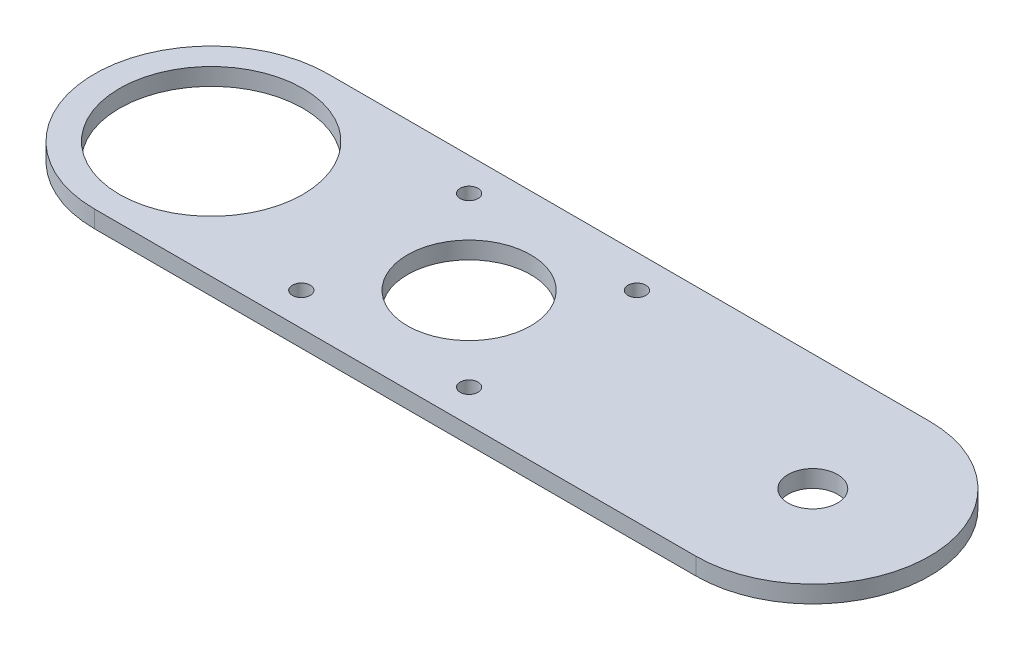
ISO-10303-21;
HEADER;
FILE_DESCRIPTION(('STEP AP214'),'2;1');
FILE_NAME('part.step','',(''),(''),'','','');
FILE_SCHEMA(('AUTOMOTIVE_DESIGN { 1 0 10303 214 1 1 1 1 }'));
ENDSEC;
DATA;
#1=APPLICATION_CONTEXT('core data for automotive mechanical design processes');
#2=APPLICATION_PROTOCOL_DEFINITION('international standard','automotive_design',2000,#1);
#3=PRODUCT_CONTEXT('',#1,'mechanical');
#4=PRODUCT('Part','Part','',(#3));
#5=PRODUCT_RELATED_PRODUCT_CATEGORY('part','',(#4));
#6=PRODUCT_DEFINITION_FORMATION('','',#4);
#7=PRODUCT_DEFINITION_CONTEXT('part definition',#1,'design');
#8=PRODUCT_DEFINITION('design','',#6,#7);
#9=PRODUCT_DEFINITION_SHAPE('','',#8);
#10=(LENGTH_UNIT() NAMED_UNIT(*) SI_UNIT(.MILLI.,.METRE.));
#11=(NAMED_UNIT(*) PLANE_ANGLE_UNIT() SI_UNIT($,.RADIAN.));
#12=(NAMED_UNIT(*) SI_UNIT($,.STERADIAN.) SOLID_ANGLE_UNIT());
#13=UNCERTAINTY_MEASURE_WITH_UNIT(LENGTH_MEASURE(1.E-05),#10,'distance_accuracy_value','');
#14=(GEOMETRIC_REPRESENTATION_CONTEXT(3) GLOBAL_UNCERTAINTY_ASSIGNED_CONTEXT((#13)) GLOBAL_UNIT_ASSIGNED_CONTEXT((#10,
#11,#12)) REPRESENTATION_CONTEXT('',''));
#15=CARTESIAN_POINT('',(0.,0.,0.));
#16=DIRECTION('',(0.,0.,1.));
#17=DIRECTION('',(1.,0.,0.));
#18=AXIS2_PLACEMENT_3D('',#15,#16,#17);
#19=CARTESIAN_POINT('',(0.,3.175,0.));
#20=DIRECTION('',(0.,1.,0.));
#21=DIRECTION('',(0.,0.,1.));
#22=AXIS2_PLACEMENT_3D('',#19,#20,#21);
#23=PLANE('',#22);
#24=CARTESIAN_POINT('',(63.1504,3.175,-15.5));
#25=DIRECTION('',(0.,1.,0.));
#26=DIRECTION('',(0.,0.,-1.));
#27=AXIS2_PLACEMENT_3D('',#24,#25,#26);
#28=CIRCLE('',#27,1.65099999999999);
#29=CARTESIAN_POINT('',(63.1504,3.175,-17.151));
#30=VERTEX_POINT('',#29);
#31=EDGE_CURVE('E139',#30,#30,#28,.T.);
#32=ORIENTED_EDGE('',*,*,#31,.F.);
#33=EDGE_LOOP('',(#32));
#34=FACE_BOUND('',#33,.T.);
#35=CARTESIAN_POINT('',(32.1504,3.175,15.5));
#36=DIRECTION('',(0.,1.,0.));
#37=DIRECTION('',(0.,0.,1.));
#38=AXIS2_PLACEMENT_3D('',#35,#36,#37);
#39=CIRCLE('',#38,1.651);
#40=CARTESIAN_POINT('',(32.1504,3.175,17.151));
#41=VERTEX_POINT('',#40);
#42=EDGE_CURVE('E127',#41,#41,#39,.T.);
#43=ORIENTED_EDGE('',*,*,#42,.F.);
#44=EDGE_LOOP('',(#43));
#45=FACE_BOUND('',#44,.T.);
#46=CARTESIAN_POINT('',(111.1504,3.175,0.));
#47=DIRECTION('',(0.,1.,0.));
#48=DIRECTION('',(0.,0.,1.));
#49=AXIS2_PLACEMENT_3D('',#46,#47,#48);
#50=CIRCLE('',#49,4.57199999999999);
#51=CARTESIAN_POINT('',(111.1504,3.175,4.57199999999998));
#52=VERTEX_POINT('',#51);
#53=EDGE_CURVE('E115',#52,#52,#50,.T.);
#54=ORIENTED_EDGE('',*,*,#53,.F.);
#55=EDGE_LOOP('',(#54));
#56=FACE_BOUND('',#55,.T.);
#57=CARTESIAN_POINT('',(0.,3.175,0.));
#58=DIRECTION('',(0.,1.,0.));
#59=DIRECTION('',(0.,0.,1.));
#60=AXIS2_PLACEMENT_3D('',#57,#58,#59);
#61=CIRCLE('',#60,21.59);
#62=CARTESIAN_POINT('',(0.,3.175,-21.59));
#63=VERTEX_POINT('',#62);
#64=CARTESIAN_POINT('',(0.,3.175,21.59));
#65=VERTEX_POINT('',#64);
#66=EDGE_CURVE('E85',#63,#65,#61,.T.);
#67=ORIENTED_EDGE('',*,*,#66,.T.);
#68=DIRECTION('',(1.,0.,0.));
#69=VECTOR('',#68,1.);
#70=CARTESIAN_POINT('',(0.,3.175,21.59));
#71=LINE('',#70,#69);
#72=CARTESIAN_POINT('',(111.1504,3.175,21.59));
#73=VERTEX_POINT('',#72);
#74=EDGE_CURVE('E80',#65,#73,#71,.T.);
#75=ORIENTED_EDGE('',*,*,#74,.T.);
#76=CARTESIAN_POINT('',(111.1504,3.175,0.));
#77=DIRECTION('',(0.,1.,0.));
#78=DIRECTION('',(0.,0.,1.));
#79=AXIS2_PLACEMENT_3D('',#76,#77,#78);
#80=CIRCLE('',#79,21.59);
#81=CARTESIAN_POINT('',(111.1504,3.175,-21.59));
#82=VERTEX_POINT('',#81);
#83=EDGE_CURVE('E83',#73,#82,#80,.T.);
#84=ORIENTED_EDGE('',*,*,#83,.T.);
#85=DIRECTION('',(-1.,0.,0.));
#86=VECTOR('',#85,1.);
#87=CARTESIAN_POINT('',(0.,3.175,-21.59));
#88=LINE('',#87,#86);
#89=EDGE_CURVE('E50',#82,#63,#88,.T.);
#90=ORIENTED_EDGE('',*,*,#89,.T.);
#91=EDGE_LOOP('',(#67,#75,#84,#90));
#92=FACE_BOUND('',#91,.T.);
#93=CARTESIAN_POINT('',(0.,3.175,0.));
#94=DIRECTION('',(0.,1.,0.));
#95=DIRECTION('',(0.,0.,1.));
#96=AXIS2_PLACEMENT_3D('',#93,#94,#95);
#97=CIRCLE('',#96,16.9545);
#98=CARTESIAN_POINT('',(0.,3.175,16.9545));
#99=VERTEX_POINT('',#98);
#100=EDGE_CURVE('E100',#99,#99,#97,.T.);
#101=ORIENTED_EDGE('',*,*,#100,.F.);
#102=EDGE_LOOP('',(#101));
#103=FACE_BOUND('',#102,.T.);
#104=CARTESIAN_POINT('',(47.6504,3.175,0.));
#105=DIRECTION('',(0.,1.,0.));
#106=DIRECTION('',(0.,0.,1.));
#107=AXIS2_PLACEMENT_3D('',#104,#105,#106);
#108=CIRCLE('',#107,11.380999971);
#109=CARTESIAN_POINT('',(47.6504,3.175,11.380999971));
#110=VERTEX_POINT('',#109);
#111=EDGE_CURVE('E121',#110,#110,#108,.T.);
#112=ORIENTED_EDGE('',*,*,#111,.F.);
#113=EDGE_LOOP('',(#112));
#114=FACE_BOUND('',#113,.T.);
#115=CARTESIAN_POINT('',(32.1504,3.175,-15.5));
#116=DIRECTION('',(0.,1.,0.));
#117=DIRECTION('',(0.,0.,1.));
#118=AXIS2_PLACEMENT_3D('',#115,#116,#117);
#119=CIRCLE('',#118,1.651);
#120=CARTESIAN_POINT('',(32.1504,3.175,-13.849));
#121=VERTEX_POINT('',#120);
#122=EDGE_CURVE('E133',#121,#121,#119,.T.);
#123=ORIENTED_EDGE('',*,*,#122,.F.);
#124=EDGE_LOOP('',(#123));
#125=FACE_BOUND('',#124,.T.);
#126=CARTESIAN_POINT('',(63.1504,3.175,15.5));
#127=DIRECTION('',(0.,1.,0.));
#128=DIRECTION('',(0.,0.,-1.));
#129=AXIS2_PLACEMENT_3D('',#126,#127,#128);
#130=CIRCLE('',#129,1.65099999999999);
#131=CARTESIAN_POINT('',(63.1504,3.175,13.849));
#132=VERTEX_POINT('',#131);
#133=EDGE_CURVE('E145',#132,#132,#130,.T.);
#134=ORIENTED_EDGE('',*,*,#133,.F.);
#135=EDGE_LOOP('',(#134));
#136=FACE_BOUND('',#135,.T.);
#137=ADVANCED_FACE('F33',(#34,#45,#56,#92,#103,#114,#125,#136),#23,.T.);
#138=CARTESIAN_POINT('',(0.,0.,0.));
#139=DIRECTION('',(0.,1.,0.));
#140=DIRECTION('',(0.,0.,1.));
#141=AXIS2_PLACEMENT_3D('',#138,#139,#140);
#142=PLANE('',#141);
#143=CARTESIAN_POINT('',(0.,0.,0.));
#144=DIRECTION('',(0.,1.,0.));
#145=DIRECTION('',(0.,0.,1.));
#146=AXIS2_PLACEMENT_3D('',#143,#144,#145);
#147=CIRCLE('',#146,21.59);
#148=CARTESIAN_POINT('',(0.,0.,-21.59));
#149=VERTEX_POINT('',#148);
#150=CARTESIAN_POINT('',(0.,0.,21.59));
#151=VERTEX_POINT('',#150);
#152=EDGE_CURVE('E97',#149,#151,#147,.T.);
#153=ORIENTED_EDGE('',*,*,#152,.F.);
#154=DIRECTION('',(-1.,0.,0.));
#155=VECTOR('',#154,1.);
#156=CARTESIAN_POINT('',(0.,0.,-21.59));
#157=LINE('',#156,#155);
#158=CARTESIAN_POINT('',(111.1504,0.,-21.59));
#159=VERTEX_POINT('',#158);
#160=EDGE_CURVE('E73',#159,#149,#157,.T.);
#161=ORIENTED_EDGE('',*,*,#160,.F.);
#162=CARTESIAN_POINT('',(111.1504,0.,0.));
#163=DIRECTION('',(0.,1.,0.));
#164=DIRECTION('',(0.,0.,1.));
#165=AXIS2_PLACEMENT_3D('',#162,#163,#164);
#166=CIRCLE('',#165,21.59);
#167=CARTESIAN_POINT('',(111.1504,0.,21.59));
#168=VERTEX_POINT('',#167);
#169=EDGE_CURVE('E67',#168,#159,#166,.T.);
#170=ORIENTED_EDGE('',*,*,#169,.F.);
#171=DIRECTION('',(1.,0.,0.));
#172=VECTOR('',#171,1.);
#173=CARTESIAN_POINT('',(0.,0.,21.59));
#174=LINE('',#173,#172);
#175=EDGE_CURVE('E89',#151,#168,#174,.T.);
#176=ORIENTED_EDGE('',*,*,#175,.F.);
#177=EDGE_LOOP('',(#153,#161,#170,#176));
#178=FACE_BOUND('',#177,.T.);
#179=CARTESIAN_POINT('',(0.,0.,0.));
#180=DIRECTION('',(0.,1.,0.));
#181=DIRECTION('',(0.,0.,1.));
#182=AXIS2_PLACEMENT_3D('',#179,#180,#181);
#183=CIRCLE('',#182,16.9545);
#184=CARTESIAN_POINT('',(0.,0.,16.9545));
#185=VERTEX_POINT('',#184);
#186=EDGE_CURVE('E112',#185,#185,#183,.T.);
#187=ORIENTED_EDGE('',*,*,#186,.T.);
#188=EDGE_LOOP('',(#187));
#189=FACE_BOUND('',#188,.T.);
#190=CARTESIAN_POINT('',(111.1504,0.,0.));
#191=DIRECTION('',(0.,1.,0.));
#192=DIRECTION('',(0.,0.,1.));
#193=AXIS2_PLACEMENT_3D('',#190,#191,#192);
#194=CIRCLE('',#193,4.57199999999999);
#195=CARTESIAN_POINT('',(111.1504,0.,4.57199999999998));
#196=VERTEX_POINT('',#195);
#197=EDGE_CURVE('E118',#196,#196,#194,.T.);
#198=ORIENTED_EDGE('',*,*,#197,.T.);
#199=EDGE_LOOP('',(#198));
#200=FACE_BOUND('',#199,.T.);
#201=CARTESIAN_POINT('',(47.6504,0.,0.));
#202=DIRECTION('',(0.,1.,0.));
#203=DIRECTION('',(0.,0.,1.));
#204=AXIS2_PLACEMENT_3D('',#201,#202,#203);
#205=CIRCLE('',#204,11.380999971);
#206=CARTESIAN_POINT('',(47.6504,0.,11.380999971));
#207=VERTEX_POINT('',#206);
#208=EDGE_CURVE('E124',#207,#207,#205,.T.);
#209=ORIENTED_EDGE('',*,*,#208,.T.);
#210=EDGE_LOOP('',(#209));
#211=FACE_BOUND('',#210,.T.);
#212=CARTESIAN_POINT('',(32.1504,0.,15.5));
#213=DIRECTION('',(0.,1.,0.));
#214=DIRECTION('',(0.,0.,1.));
#215=AXIS2_PLACEMENT_3D('',#212,#213,#214);
#216=CIRCLE('',#215,1.651);
#217=CARTESIAN_POINT('',(32.1504,0.,17.151));
#218=VERTEX_POINT('',#217);
#219=EDGE_CURVE('E130',#218,#218,#216,.T.);
#220=ORIENTED_EDGE('',*,*,#219,.T.);
#221=EDGE_LOOP('',(#220));
#222=FACE_BOUND('',#221,.T.);
#223=CARTESIAN_POINT('',(32.1504,0.,-15.5));
#224=DIRECTION('',(0.,1.,0.));
#225=DIRECTION('',(0.,0.,1.));
#226=AXIS2_PLACEMENT_3D('',#223,#224,#225);
#227=CIRCLE('',#226,1.651);
#228=CARTESIAN_POINT('',(32.1504,0.,-13.849));
#229=VERTEX_POINT('',#228);
#230=EDGE_CURVE('E136',#229,#229,#227,.T.);
#231=ORIENTED_EDGE('',*,*,#230,.T.);
#232=EDGE_LOOP('',(#231));
#233=FACE_BOUND('',#232,.T.);
#234=CARTESIAN_POINT('',(63.1504,0.,-15.5));
#235=DIRECTION('',(0.,1.,0.));
#236=DIRECTION('',(0.,0.,-1.));
#237=AXIS2_PLACEMENT_3D('',#234,#235,#236);
#238=CIRCLE('',#237,1.65099999999999);
#239=CARTESIAN_POINT('',(63.1504,0.,-17.151));
#240=VERTEX_POINT('',#239);
#241=EDGE_CURVE('E142',#240,#240,#238,.T.);
#242=ORIENTED_EDGE('',*,*,#241,.T.);
#243=EDGE_LOOP('',(#242));
#244=FACE_BOUND('',#243,.T.);
#245=CARTESIAN_POINT('',(63.1504,0.,15.5));
#246=DIRECTION('',(0.,1.,0.));
#247=DIRECTION('',(0.,0.,-1.));
#248=AXIS2_PLACEMENT_3D('',#245,#246,#247);
#249=CIRCLE('',#248,1.65099999999999);
#250=CARTESIAN_POINT('',(63.1504,0.,13.849));
#251=VERTEX_POINT('',#250);
#252=EDGE_CURVE('E148',#251,#251,#249,.T.);
#253=ORIENTED_EDGE('',*,*,#252,.T.);
#254=EDGE_LOOP('',(#253));
#255=FACE_BOUND('',#254,.T.);
#256=ADVANCED_FACE('F108',(#178,#189,#200,#211,#222,#233,#244,#255),#142,.F.);
#257=CARTESIAN_POINT('',(0.,3.175,0.));
#258=DIRECTION('',(0.,-1.,0.));
#259=DIRECTION('',(0.,0.,-1.));
#260=AXIS2_PLACEMENT_3D('',#257,#258,#259);
#261=CYLINDRICAL_SURFACE('',#260,21.59);
#262=ORIENTED_EDGE('',*,*,#152,.T.);
#263=DIRECTION('',(0.,-1.,0.));
#264=VECTOR('',#263,1.);
#265=CARTESIAN_POINT('',(0.,3.175,21.59));
#266=LINE('',#265,#264);
#267=EDGE_CURVE('E11',#65,#151,#266,.T.);
#268=ORIENTED_EDGE('',*,*,#267,.F.);
#269=ORIENTED_EDGE('',*,*,#66,.F.);
#270=DIRECTION('',(0.,-1.,0.));
#271=VECTOR('',#270,1.);
#272=CARTESIAN_POINT('',(0.,3.175,-21.59));
#273=LINE('',#272,#271);
#274=EDGE_CURVE('E93',#63,#149,#273,.T.);
#275=ORIENTED_EDGE('',*,*,#274,.T.);
#276=EDGE_LOOP('',(#262,#268,#269,#275));
#277=FACE_BOUND('',#276,.T.);
#278=ADVANCED_FACE('F35',(#277),#261,.T.);
#279=CARTESIAN_POINT('',(0.,3.175,21.59));
#280=DIRECTION('',(0.,0.,-1.));
#281=DIRECTION('',(-1.,0.,0.));
#282=AXIS2_PLACEMENT_3D('',#279,#280,#281);
#283=PLANE('',#282);
#284=ORIENTED_EDGE('',*,*,#175,.T.);
#285=DIRECTION('',(0.,-1.,0.));
#286=VECTOR('',#285,1.);
#287=CARTESIAN_POINT('',(111.1504,3.175,21.59));
#288=LINE('',#287,#286);
#289=EDGE_CURVE('E42',#73,#168,#288,.T.);
#290=ORIENTED_EDGE('',*,*,#289,.F.);
#291=ORIENTED_EDGE('',*,*,#74,.F.);
#292=ORIENTED_EDGE('',*,*,#267,.T.);
#293=EDGE_LOOP('',(#284,#290,#291,#292));
#294=FACE_BOUND('',#293,.T.);
#295=ADVANCED_FACE('F88',(#294),#283,.F.);
#296=CARTESIAN_POINT('',(111.1504,3.175,0.));
#297=DIRECTION('',(0.,-1.,0.));
#298=DIRECTION('',(0.,0.,-1.));
#299=AXIS2_PLACEMENT_3D('',#296,#297,#298);
#300=CYLINDRICAL_SURFACE('',#299,21.59);
#301=ORIENTED_EDGE('',*,*,#169,.T.);
#302=DIRECTION('',(0.,-1.,0.));
#303=VECTOR('',#302,1.);
#304=CARTESIAN_POINT('',(111.1504,3.175,-21.59));
#305=LINE('',#304,#303);
#306=EDGE_CURVE('E90',#82,#159,#305,.T.);
#307=ORIENTED_EDGE('',*,*,#306,.F.);
#308=ORIENTED_EDGE('',*,*,#83,.F.);
#309=ORIENTED_EDGE('',*,*,#289,.T.);
#310=EDGE_LOOP('',(#301,#307,#308,#309));
#311=FACE_BOUND('',#310,.T.);
#312=ADVANCED_FACE('F91',(#311),#300,.T.);
#313=CARTESIAN_POINT('',(0.,3.175,-21.59));
#314=DIRECTION('',(0.,0.,1.));
#315=DIRECTION('',(1.,0.,0.));
#316=AXIS2_PLACEMENT_3D('',#313,#314,#315);
#317=PLANE('',#316);
#318=ORIENTED_EDGE('',*,*,#160,.T.);
#319=ORIENTED_EDGE('',*,*,#274,.F.);
#320=ORIENTED_EDGE('',*,*,#89,.F.);
#321=ORIENTED_EDGE('',*,*,#306,.T.);
#322=EDGE_LOOP('',(#318,#319,#320,#321));
#323=FACE_BOUND('',#322,.T.);
#324=ADVANCED_FACE('F105',(#323),#317,.F.);
#325=CARTESIAN_POINT('',(0.,3.175,0.));
#326=DIRECTION('',(0.,-1.,0.));
#327=DIRECTION('',(0.,0.,-1.));
#328=AXIS2_PLACEMENT_3D('',#325,#326,#327);
#329=CYLINDRICAL_SURFACE('',#328,16.9545);
#330=ORIENTED_EDGE('',*,*,#100,.T.);
#331=EDGE_LOOP('',(#330));
#332=FACE_BOUND('',#331,.T.);
#333=ORIENTED_EDGE('',*,*,#186,.F.);
#334=EDGE_LOOP('',(#333));
#335=FACE_BOUND('',#334,.T.);
#336=ADVANCED_FACE('F167',(#332,#335),#329,.F.);
#337=CARTESIAN_POINT('',(111.1504,3.175,0.));
#338=DIRECTION('',(0.,-1.,0.));
#339=DIRECTION('',(0.,0.,-1.));
#340=AXIS2_PLACEMENT_3D('',#337,#338,#339);
#341=CYLINDRICAL_SURFACE('',#340,4.57199999999999);
#342=ORIENTED_EDGE('',*,*,#53,.T.);
#343=EDGE_LOOP('',(#342));
#344=FACE_BOUND('',#343,.T.);
#345=ORIENTED_EDGE('',*,*,#197,.F.);
#346=EDGE_LOOP('',(#345));
#347=FACE_BOUND('',#346,.T.);
#348=ADVANCED_FACE('F213',(#344,#347),#341,.F.);
#349=CARTESIAN_POINT('',(47.6504,3.175,0.));
#350=DIRECTION('',(0.,-1.,0.));
#351=DIRECTION('',(0.,0.,-1.));
#352=AXIS2_PLACEMENT_3D('',#349,#350,#351);
#353=CYLINDRICAL_SURFACE('',#352,11.380999971);
#354=ORIENTED_EDGE('',*,*,#111,.T.);
#355=EDGE_LOOP('',(#354));
#356=FACE_BOUND('',#355,.T.);
#357=ORIENTED_EDGE('',*,*,#208,.F.);
#358=EDGE_LOOP('',(#357));
#359=FACE_BOUND('',#358,.T.);
#360=ADVANCED_FACE('F221',(#356,#359),#353,.F.);
#361=CARTESIAN_POINT('',(32.1504,3.175,15.5));
#362=DIRECTION('',(0.,-1.,0.));
#363=DIRECTION('',(0.,0.,-1.));
#364=AXIS2_PLACEMENT_3D('',#361,#362,#363);
#365=CYLINDRICAL_SURFACE('',#364,1.651);
#366=ORIENTED_EDGE('',*,*,#42,.T.);
#367=EDGE_LOOP('',(#366));
#368=FACE_BOUND('',#367,.T.);
#369=ORIENTED_EDGE('',*,*,#219,.F.);
#370=EDGE_LOOP('',(#369));
#371=FACE_BOUND('',#370,.T.);
#372=ADVANCED_FACE('F229',(#368,#371),#365,.F.);
#373=CARTESIAN_POINT('',(32.1504,3.175,-15.5));
#374=DIRECTION('',(0.,-1.,0.));
#375=DIRECTION('',(0.,0.,-1.));
#376=AXIS2_PLACEMENT_3D('',#373,#374,#375);
#377=CYLINDRICAL_SURFACE('',#376,1.651);
#378=ORIENTED_EDGE('',*,*,#122,.T.);
#379=EDGE_LOOP('',(#378));
#380=FACE_BOUND('',#379,.T.);
#381=ORIENTED_EDGE('',*,*,#230,.F.);
#382=EDGE_LOOP('',(#381));
#383=FACE_BOUND('',#382,.T.);
#384=ADVANCED_FACE('F238',(#380,#383),#377,.F.);
#385=CARTESIAN_POINT('',(63.1504,3.175,-15.5));
#386=DIRECTION('',(0.,-1.,0.));
#387=DIRECTION('',(0.,0.,-1.));
#388=AXIS2_PLACEMENT_3D('',#385,#386,#387);
#389=CYLINDRICAL_SURFACE('',#388,1.65099999999999);
#390=ORIENTED_EDGE('',*,*,#31,.T.);
#391=EDGE_LOOP('',(#390));
#392=FACE_BOUND('',#391,.T.);
#393=ORIENTED_EDGE('',*,*,#241,.F.);
#394=EDGE_LOOP('',(#393));
#395=FACE_BOUND('',#394,.T.);
#396=ADVANCED_FACE('F247',(#392,#395),#389,.F.);
#397=CARTESIAN_POINT('',(63.1504,3.175,15.5));
#398=DIRECTION('',(0.,-1.,0.));
#399=DIRECTION('',(0.,0.,-1.));
#400=AXIS2_PLACEMENT_3D('',#397,#398,#399);
#401=CYLINDRICAL_SURFACE('',#400,1.65099999999999);
#402=ORIENTED_EDGE('',*,*,#133,.T.);
#403=EDGE_LOOP('',(#402));
#404=FACE_BOUND('',#403,.T.);
#405=ORIENTED_EDGE('',*,*,#252,.F.);
#406=EDGE_LOOP('',(#405));
#407=FACE_BOUND('',#406,.T.);
#408=ADVANCED_FACE('F154',(#404,#407),#401,.F.);
#409=CLOSED_SHELL('',(#137,#256,#278,#295,#312,#324,#336,#348,#360,#372,#384,#396,#408));
#410=MANIFOLD_SOLID_BREP('B2',#409);
#411=ADVANCED_BREP_SHAPE_REPRESENTATION('',(#18,#410),#14);
#412=SHAPE_DEFINITION_REPRESENTATION(#9,#411);
ENDSEC;
END-ISO-10303-21;
